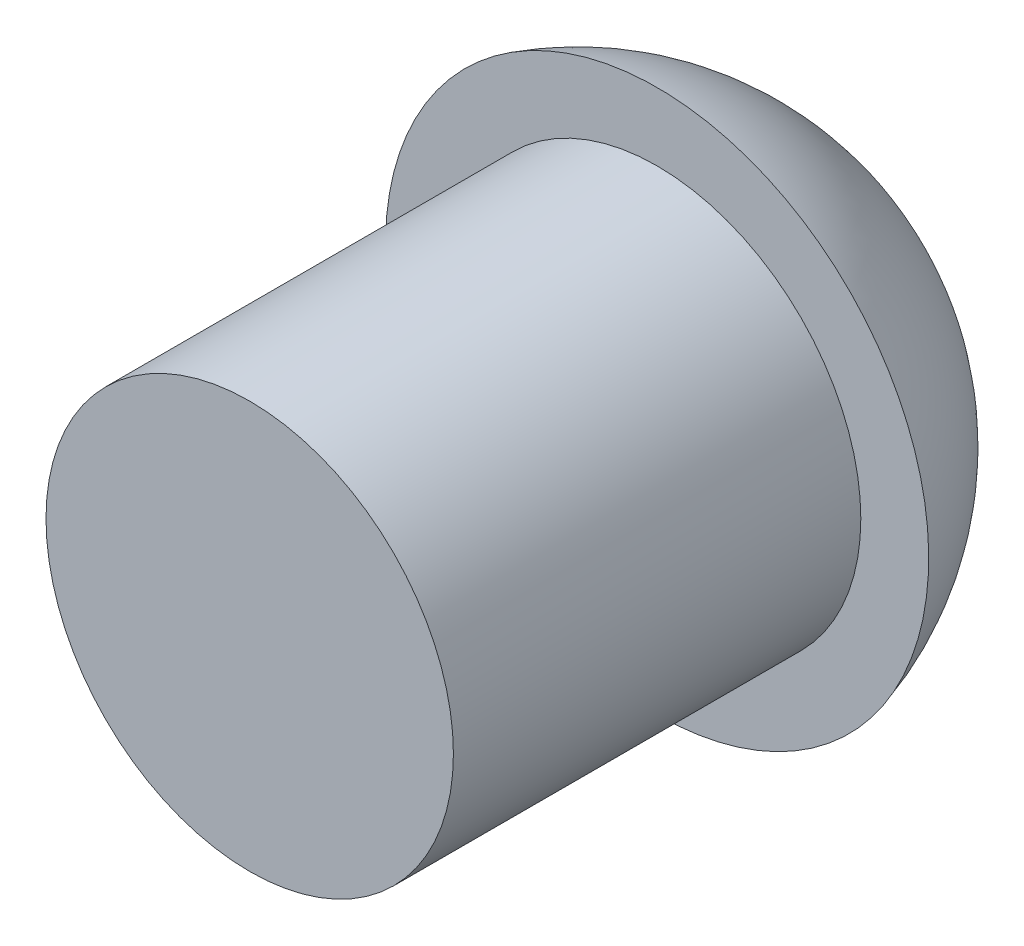
ISO-10303-21;
HEADER;
FILE_DESCRIPTION(('STEP AP214'),'2;1');
FILE_NAME('part.step','',(''),(''),'','','');
FILE_SCHEMA(('AUTOMOTIVE_DESIGN { 1 0 10303 214 1 1 1 1 }'));
ENDSEC;
DATA;
#1=APPLICATION_CONTEXT('core data for automotive mechanical design processes');
#2=APPLICATION_PROTOCOL_DEFINITION('international standard','automotive_design',2000,#1);
#3=PRODUCT_CONTEXT('',#1,'mechanical');
#4=PRODUCT('Part','Part','',(#3));
#5=PRODUCT_RELATED_PRODUCT_CATEGORY('part','',(#4));
#6=PRODUCT_DEFINITION_FORMATION('','',#4);
#7=PRODUCT_DEFINITION_CONTEXT('part definition',#1,'design');
#8=PRODUCT_DEFINITION('design','',#6,#7);
#9=PRODUCT_DEFINITION_SHAPE('','',#8);
#10=(LENGTH_UNIT() NAMED_UNIT(*) SI_UNIT(.MILLI.,.METRE.));
#11=(NAMED_UNIT(*) PLANE_ANGLE_UNIT() SI_UNIT($,.RADIAN.));
#12=(NAMED_UNIT(*) SI_UNIT($,.STERADIAN.) SOLID_ANGLE_UNIT());
#13=UNCERTAINTY_MEASURE_WITH_UNIT(LENGTH_MEASURE(1.E-05),#10,'distance_accuracy_value','');
#14=(GEOMETRIC_REPRESENTATION_CONTEXT(3) GLOBAL_UNCERTAINTY_ASSIGNED_CONTEXT((#13)) GLOBAL_UNIT_ASSIGNED_CONTEXT((#10,
#11,#12)) REPRESENTATION_CONTEXT('',''));
#15=CARTESIAN_POINT('',(0.,0.,0.));
#16=DIRECTION('',(0.,0.,1.));
#17=DIRECTION('',(1.,0.,0.));
#18=AXIS2_PLACEMENT_3D('',#15,#16,#17);
#19=CARTESIAN_POINT('',(0.,0.,1.16666666666667));
#20=DIRECTION('',(0.,0.,1.));
#21=DIRECTION('',(0.,-1.,0.));
#22=AXIS2_PLACEMENT_3D('',#19,#20,#21);
#23=SPHERICAL_SURFACE('',#22,4.16666666666667);
#24=CARTESIAN_POINT('',(0.,0.,0.));
#25=DIRECTION('',(0.,0.,1.));
#26=DIRECTION('',(0.,-1.,0.));
#27=AXIS2_PLACEMENT_3D('',#24,#25,#26);
#28=CIRCLE('',#27,4.);
#29=CARTESIAN_POINT('',(0.,-4.,0.));
#30=VERTEX_POINT('',#29);
#31=EDGE_CURVE('E123',#30,#30,#28,.T.);
#32=ORIENTED_EDGE('',*,*,#31,.F.);
#33=EDGE_LOOP('',(#32));
#34=FACE_BOUND('',#33,.T.);
#35=CARTESIAN_POINT('',(-0.905600575752205,0.905600575752215,1.16666666666667));
#36=DIRECTION('',(0.707106781186544,-0.707106781186552,0.));
#37=DIRECTION('',(0.707106781186552,0.707106781186544,0.));
#38=AXIS2_PLACEMENT_3D('',#35,#36,#37);
#39=CIRCLE('',#38,3.96495728924104);
#40=CARTESIAN_POINT('',(-1.4142135623731,0.396987589131322,-2.73250144527552));
#41=VERTEX_POINT('',#40);
#42=CARTESIAN_POINT('',(0.,1.81120115150441,-2.58575408531467));
#43=VERTEX_POINT('',#42);
#44=EDGE_CURVE('E11',#41,#43,#39,.T.);
#45=ORIENTED_EDGE('',*,*,#44,.F.);
#46=CARTESIAN_POINT('',(0.,0.396987589131322,1.16666666666667));
#47=DIRECTION('',(0.,1.,0.));
#48=DIRECTION('',(-1.,0.,0.));
#49=AXIS2_PLACEMENT_3D('',#46,#47,#48);
#50=CIRCLE('',#49,4.14771165405538);
#51=CARTESIAN_POINT('',(-0.664213562373102,0.396987589131322,-2.92751607336173));
#52=VERTEX_POINT('',#51);
#53=EDGE_CURVE('E54',#52,#41,#50,.T.);
#54=ORIENTED_EDGE('',*,*,#53,.F.);
#55=CARTESIAN_POINT('',(-0.664213562373102,0.,1.16666666666667));
#56=DIRECTION('',(1.,0.,0.));
#57=DIRECTION('',(0.,1.,0.));
#58=AXIS2_PLACEMENT_3D('',#55,#56,#57);
#59=CIRCLE('',#58,4.1133844282623);
#60=CARTESIAN_POINT('',(-0.664213562373103,-1.60301241086868,-2.62151002737385));
#61=VERTEX_POINT('',#60);
#62=EDGE_CURVE('E154',#61,#52,#59,.T.);
#63=ORIENTED_EDGE('',*,*,#62,.F.);
#64=CARTESIAN_POINT('',(0.,-1.60301241086868,1.16666666666667));
#65=DIRECTION('',(0.,1.,0.));
#66=DIRECTION('',(0.,0.,1.));
#67=AXIS2_PLACEMENT_3D('',#64,#65,#66);
#68=CIRCLE('',#67,3.84596702036199);
#69=CARTESIAN_POINT('',(0.664213562373103,-1.60301241086868,-2.62151002737385));
#70=VERTEX_POINT('',#69);
#71=EDGE_CURVE('E151',#70,#61,#68,.T.);
#72=ORIENTED_EDGE('',*,*,#71,.F.);
#73=CARTESIAN_POINT('',(0.664213562373102,0.,1.16666666666667));
#74=DIRECTION('',(-1.,0.,0.));
#75=DIRECTION('',(0.,-1.,0.));
#76=AXIS2_PLACEMENT_3D('',#73,#74,#75);
#77=CIRCLE('',#76,4.1133844282623);
#78=CARTESIAN_POINT('',(0.664213562373102,0.396987589131322,-2.92751607336173));
#79=VERTEX_POINT('',#78);
#80=EDGE_CURVE('E148',#79,#70,#77,.T.);
#81=ORIENTED_EDGE('',*,*,#80,.F.);
#82=CARTESIAN_POINT('',(0.,0.396987589131321,1.16666666666667));
#83=DIRECTION('',(0.,1.,0.));
#84=DIRECTION('',(-1.,0.,0.));
#85=AXIS2_PLACEMENT_3D('',#82,#83,#84);
#86=CIRCLE('',#85,4.14771165405538);
#87=CARTESIAN_POINT('',(1.4142135623731,0.396987589131323,-2.73250144527552));
#88=VERTEX_POINT('',#87);
#89=EDGE_CURVE('E145',#88,#79,#86,.T.);
#90=ORIENTED_EDGE('',*,*,#89,.F.);
#91=CARTESIAN_POINT('',(0.905600575752205,0.905600575752216,1.16666666666667));
#92=DIRECTION('',(-0.707106781186543,-0.707106781186552,0.));
#93=DIRECTION('',(0.707106781186552,-0.707106781186543,0.));
#94=AXIS2_PLACEMENT_3D('',#91,#92,#93);
#95=CIRCLE('',#94,3.96495728924104);
#96=EDGE_CURVE('E142',#43,#88,#95,.T.);
#97=ORIENTED_EDGE('',*,*,#96,.F.);
#98=EDGE_LOOP('',(#45,#54,#63,#72,#81,#90,#97));
#99=FACE_BOUND('',#98,.T.);
#100=ADVANCED_FACE('F45',(#34,#99),#23,.T.);
#101=CARTESIAN_POINT('',(0.,0.,6.));
#102=DIRECTION('',(0.,0.,-1.));
#103=DIRECTION('',(-1.,0.,0.));
#104=AXIS2_PLACEMENT_3D('',#101,#102,#103);
#105=CYLINDRICAL_SURFACE('',#104,3.);
#106=CARTESIAN_POINT('',(0.,0.,6.));
#107=DIRECTION('',(0.,0.,1.));
#108=DIRECTION('',(1.,0.,0.));
#109=AXIS2_PLACEMENT_3D('',#106,#107,#108);
#110=CIRCLE('',#109,3.);
#111=CARTESIAN_POINT('',(3.,0.,6.));
#112=VERTEX_POINT('',#111);
#113=EDGE_CURVE('E138',#112,#112,#110,.T.);
#114=ORIENTED_EDGE('',*,*,#113,.F.);
#115=EDGE_LOOP('',(#114));
#116=FACE_BOUND('',#115,.T.);
#117=CARTESIAN_POINT('',(0.,0.,0.));
#118=DIRECTION('',(0.,0.,-1.));
#119=DIRECTION('',(0.,1.,0.));
#120=AXIS2_PLACEMENT_3D('',#117,#118,#119);
#121=CIRCLE('',#120,3.);
#122=CARTESIAN_POINT('',(0.,3.,0.));
#123=VERTEX_POINT('',#122);
#124=EDGE_CURVE('E129',#123,#123,#121,.T.);
#125=ORIENTED_EDGE('',*,*,#124,.F.);
#126=EDGE_LOOP('',(#125));
#127=FACE_BOUND('',#126,.T.);
#128=ADVANCED_FACE('F47',(#116,#127),#105,.T.);
#129=CARTESIAN_POINT('',(0.,0.,6.));
#130=DIRECTION('',(0.,0.,1.));
#131=DIRECTION('',(1.,0.,0.));
#132=AXIS2_PLACEMENT_3D('',#129,#130,#131);
#133=PLANE('',#132);
#134=ORIENTED_EDGE('',*,*,#113,.T.);
#135=EDGE_LOOP('',(#134));
#136=FACE_BOUND('',#135,.T.);
#137=ADVANCED_FACE('F224',(#136),#133,.T.);
#138=CARTESIAN_POINT('',(0.,-4.,0.));
#139=DIRECTION('',(0.,0.,-1.));
#140=DIRECTION('',(0.,1.,0.));
#141=AXIS2_PLACEMENT_3D('',#138,#139,#140);
#142=PLANE('',#141);
#143=ORIENTED_EDGE('',*,*,#124,.T.);
#144=EDGE_LOOP('',(#143));
#145=FACE_BOUND('',#144,.T.);
#146=ORIENTED_EDGE('',*,*,#31,.T.);
#147=EDGE_LOOP('',(#146));
#148=FACE_BOUND('',#147,.T.);
#149=ADVANCED_FACE('F228',(#145,#148),#142,.F.);
#150=CARTESIAN_POINT('',(0.,1.81120115150441,-2.));
#151=DIRECTION('',(0.707106781186544,-0.707106781186552,0.));
#152=DIRECTION('',(0.707106781186552,0.707106781186544,0.));
#153=AXIS2_PLACEMENT_3D('',#150,#151,#152);
#154=PLANE('',#153);
#155=ORIENTED_EDGE('',*,*,#44,.T.);
#156=DIRECTION('',(0.,0.,-1.));
#157=VECTOR('',#156,1.);
#158=CARTESIAN_POINT('',(0.,1.81120115150441,-2.));
#159=LINE('',#158,#157);
#160=CARTESIAN_POINT('',(0.,1.81120115150441,-2.));
#161=VERTEX_POINT('',#160);
#162=EDGE_CURVE('E61',#161,#43,#159,.T.);
#163=ORIENTED_EDGE('',*,*,#162,.F.);
#164=DIRECTION('',(-0.707106781186551,-0.707106781186544,0.));
#165=VECTOR('',#164,1.);
#166=CARTESIAN_POINT('',(0.,1.81120115150441,-2.));
#167=LINE('',#166,#165);
#168=CARTESIAN_POINT('',(-1.4142135623731,0.396987589131322,-2.));
#169=VERTEX_POINT('',#168);
#170=EDGE_CURVE('E109',#161,#169,#167,.T.);
#171=ORIENTED_EDGE('',*,*,#170,.T.);
#172=DIRECTION('',(0.,0.,-1.));
#173=VECTOR('',#172,1.);
#174=CARTESIAN_POINT('',(-1.4142135623731,0.396987589131322,-2.));
#175=LINE('',#174,#173);
#176=EDGE_CURVE('E117',#169,#41,#175,.T.);
#177=ORIENTED_EDGE('',*,*,#176,.T.);
#178=EDGE_LOOP('',(#155,#163,#171,#177));
#179=FACE_BOUND('',#178,.T.);
#180=ADVANCED_FACE('F116',(#179),#154,.T.);
#181=CARTESIAN_POINT('',(-1.4142135623731,0.396987589131322,-2.));
#182=DIRECTION('',(0.,1.,0.));
#183=DIRECTION('',(-1.,0.,0.));
#184=AXIS2_PLACEMENT_3D('',#181,#182,#183);
#185=PLANE('',#184);
#186=ORIENTED_EDGE('',*,*,#53,.T.);
#187=ORIENTED_EDGE('',*,*,#176,.F.);
#188=DIRECTION('',(1.,0.,0.));
#189=VECTOR('',#188,1.);
#190=CARTESIAN_POINT('',(-1.4142135623731,0.396987589131322,-2.));
#191=LINE('',#190,#189);
#192=CARTESIAN_POINT('',(-0.664213562373102,0.396987589131322,-2.));
#193=VERTEX_POINT('',#192);
#194=EDGE_CURVE('E105',#169,#193,#191,.T.);
#195=ORIENTED_EDGE('',*,*,#194,.T.);
#196=DIRECTION('',(0.,0.,-1.));
#197=VECTOR('',#196,1.);
#198=CARTESIAN_POINT('',(-0.664213562373102,0.396987589131322,-2.));
#199=LINE('',#198,#197);
#200=EDGE_CURVE('E124',#193,#52,#199,.T.);
#201=ORIENTED_EDGE('',*,*,#200,.T.);
#202=EDGE_LOOP('',(#186,#187,#195,#201));
#203=FACE_BOUND('',#202,.T.);
#204=ADVANCED_FACE('F121',(#203),#185,.T.);
#205=CARTESIAN_POINT('',(-0.664213562373102,0.396987589131322,-2.));
#206=DIRECTION('',(1.,0.,0.));
#207=DIRECTION('',(0.,1.,0.));
#208=AXIS2_PLACEMENT_3D('',#205,#206,#207);
#209=PLANE('',#208);
#210=ORIENTED_EDGE('',*,*,#62,.T.);
#211=ORIENTED_EDGE('',*,*,#200,.F.);
#212=DIRECTION('',(0.,-1.,0.));
#213=VECTOR('',#212,1.);
#214=CARTESIAN_POINT('',(-0.664213562373102,0.396987589131322,-2.));
#215=LINE('',#214,#213);
#216=CARTESIAN_POINT('',(-0.664213562373103,-1.60301241086868,-2.));
#217=VERTEX_POINT('',#216);
#218=EDGE_CURVE('E111',#193,#217,#215,.T.);
#219=ORIENTED_EDGE('',*,*,#218,.T.);
#220=DIRECTION('',(0.,0.,-1.));
#221=VECTOR('',#220,1.);
#222=CARTESIAN_POINT('',(-0.664213562373103,-1.60301241086868,-2.));
#223=LINE('',#222,#221);
#224=EDGE_CURVE('E131',#217,#61,#223,.T.);
#225=ORIENTED_EDGE('',*,*,#224,.T.);
#226=EDGE_LOOP('',(#210,#211,#219,#225));
#227=FACE_BOUND('',#226,.T.);
#228=ADVANCED_FACE('F160',(#227),#209,.T.);
#229=CARTESIAN_POINT('',(0.664213562373103,-1.60301241086868,-2.));
#230=DIRECTION('',(0.,1.,0.));
#231=DIRECTION('',(0.,0.,1.));
#232=AXIS2_PLACEMENT_3D('',#229,#230,#231);
#233=PLANE('',#232);
#234=ORIENTED_EDGE('',*,*,#71,.T.);
#235=ORIENTED_EDGE('',*,*,#224,.F.);
#236=DIRECTION('',(1.,0.,0.));
#237=VECTOR('',#236,1.);
#238=CARTESIAN_POINT('',(0.664213562373103,-1.60301241086868,-2.));
#239=LINE('',#238,#237);
#240=CARTESIAN_POINT('',(0.664213562373103,-1.60301241086868,-2.));
#241=VERTEX_POINT('',#240);
#242=EDGE_CURVE('E194',#217,#241,#239,.T.);
#243=ORIENTED_EDGE('',*,*,#242,.T.);
#244=DIRECTION('',(0.,0.,-1.));
#245=VECTOR('',#244,1.);
#246=CARTESIAN_POINT('',(0.664213562373103,-1.60301241086868,-2.));
#247=LINE('',#246,#245);
#248=EDGE_CURVE('E182',#241,#70,#247,.T.);
#249=ORIENTED_EDGE('',*,*,#248,.T.);
#250=EDGE_LOOP('',(#234,#235,#243,#249));
#251=FACE_BOUND('',#250,.T.);
#252=ADVANCED_FACE('F193',(#251),#233,.T.);
#253=CARTESIAN_POINT('',(0.664213562373102,0.396987589131322,-2.));
#254=DIRECTION('',(-1.,0.,0.));
#255=DIRECTION('',(0.,-1.,0.));
#256=AXIS2_PLACEMENT_3D('',#253,#254,#255);
#257=PLANE('',#256);
#258=ORIENTED_EDGE('',*,*,#80,.T.);
#259=ORIENTED_EDGE('',*,*,#248,.F.);
#260=DIRECTION('',(0.,1.,0.));
#261=VECTOR('',#260,1.);
#262=CARTESIAN_POINT('',(0.664213562373102,0.396987589131322,-2.));
#263=LINE('',#262,#261);
#264=CARTESIAN_POINT('',(0.664213562373102,0.396987589131322,-2.));
#265=VERTEX_POINT('',#264);
#266=EDGE_CURVE('E198',#241,#265,#263,.T.);
#267=ORIENTED_EDGE('',*,*,#266,.T.);
#268=DIRECTION('',(0.,0.,-1.));
#269=VECTOR('',#268,1.);
#270=CARTESIAN_POINT('',(0.664213562373102,0.396987589131322,-2.));
#271=LINE('',#270,#269);
#272=EDGE_CURVE('E178',#265,#79,#271,.T.);
#273=ORIENTED_EDGE('',*,*,#272,.T.);
#274=EDGE_LOOP('',(#258,#259,#267,#273));
#275=FACE_BOUND('',#274,.T.);
#276=ADVANCED_FACE('F197',(#275),#257,.T.);
#277=CARTESIAN_POINT('',(1.4142135623731,0.396987589131322,-2.));
#278=DIRECTION('',(0.,1.,0.));
#279=DIRECTION('',(-1.,0.,0.));
#280=AXIS2_PLACEMENT_3D('',#277,#278,#279);
#281=PLANE('',#280);
#282=ORIENTED_EDGE('',*,*,#89,.T.);
#283=ORIENTED_EDGE('',*,*,#272,.F.);
#284=DIRECTION('',(1.,0.,0.));
#285=VECTOR('',#284,1.);
#286=CARTESIAN_POINT('',(1.4142135623731,0.396987589131322,-2.));
#287=LINE('',#286,#285);
#288=CARTESIAN_POINT('',(1.4142135623731,0.396987589131322,-2.));
#289=VERTEX_POINT('',#288);
#290=EDGE_CURVE('E176',#265,#289,#287,.T.);
#291=ORIENTED_EDGE('',*,*,#290,.T.);
#292=DIRECTION('',(0.,0.,-1.));
#293=VECTOR('',#292,1.);
#294=CARTESIAN_POINT('',(1.4142135623731,0.396987589131322,-2.));
#295=LINE('',#294,#293);
#296=EDGE_CURVE('E170',#289,#88,#295,.T.);
#297=ORIENTED_EDGE('',*,*,#296,.T.);
#298=EDGE_LOOP('',(#282,#283,#291,#297));
#299=FACE_BOUND('',#298,.T.);
#300=ADVANCED_FACE('F172',(#299),#281,.T.);
#301=CARTESIAN_POINT('',(0.,1.81120115150441,-2.));
#302=DIRECTION('',(-0.707106781186543,-0.707106781186552,0.));
#303=DIRECTION('',(0.707106781186552,-0.707106781186543,0.));
#304=AXIS2_PLACEMENT_3D('',#301,#302,#303);
#305=PLANE('',#304);
#306=ORIENTED_EDGE('',*,*,#96,.T.);
#307=ORIENTED_EDGE('',*,*,#296,.F.);
#308=DIRECTION('',(-0.707106781186552,0.707106781186543,0.));
#309=VECTOR('',#308,1.);
#310=CARTESIAN_POINT('',(0.,1.81120115150441,-2.));
#311=LINE('',#310,#309);
#312=EDGE_CURVE('E184',#289,#161,#311,.T.);
#313=ORIENTED_EDGE('',*,*,#312,.T.);
#314=ORIENTED_EDGE('',*,*,#162,.T.);
#315=EDGE_LOOP('',(#306,#307,#313,#314));
#316=FACE_BOUND('',#315,.T.);
#317=ADVANCED_FACE('F169',(#316),#305,.T.);
#318=CARTESIAN_POINT('',(0.,0.,-2.));
#319=DIRECTION('',(0.,0.,1.));
#320=DIRECTION('',(1.,0.,0.));
#321=AXIS2_PLACEMENT_3D('',#318,#319,#320);
#322=PLANE('',#321);
#323=ORIENTED_EDGE('',*,*,#170,.F.);
#324=ORIENTED_EDGE('',*,*,#312,.F.);
#325=ORIENTED_EDGE('',*,*,#290,.F.);
#326=ORIENTED_EDGE('',*,*,#266,.F.);
#327=ORIENTED_EDGE('',*,*,#242,.F.);
#328=ORIENTED_EDGE('',*,*,#218,.F.);
#329=ORIENTED_EDGE('',*,*,#194,.F.);
#330=EDGE_LOOP('',(#323,#324,#325,#326,#327,#328,#329));
#331=FACE_BOUND('',#330,.T.);
#332=ADVANCED_FACE('F107',(#331),#322,.F.);
#333=CLOSED_SHELL('',(#100,#128,#137,#149,#180,#204,#228,#252,#276,#300,#317,#332));
#334=MANIFOLD_SOLID_BREP('B2',#333);
#335=ADVANCED_BREP_SHAPE_REPRESENTATION('',(#18,#334),#14);
#336=SHAPE_DEFINITION_REPRESENTATION(#9,#335);
ENDSEC;
END-ISO-10303-21;
